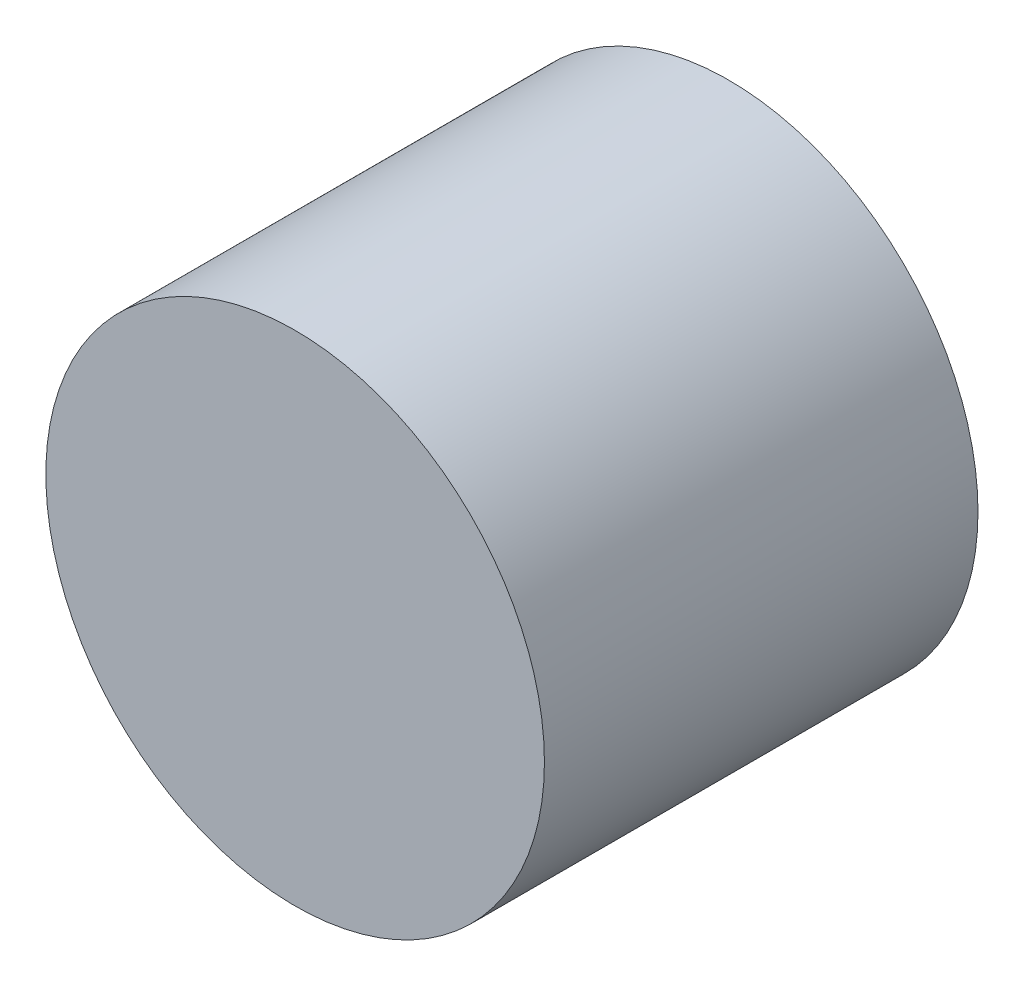
ISO-10303-21;
HEADER;
FILE_DESCRIPTION(('STEP AP214'),'2;1');
FILE_NAME('part.step','',(''),(''),'','','');
FILE_SCHEMA(('AUTOMOTIVE_DESIGN { 1 0 10303 214 1 1 1 1 }'));
ENDSEC;
DATA;
#1=APPLICATION_CONTEXT('core data for automotive mechanical design processes');
#2=APPLICATION_PROTOCOL_DEFINITION('international standard','automotive_design',2000,#1);
#3=PRODUCT_CONTEXT('',#1,'mechanical');
#4=PRODUCT('Part','Part','',(#3));
#5=PRODUCT_RELATED_PRODUCT_CATEGORY('part','',(#4));
#6=PRODUCT_DEFINITION_FORMATION('','',#4);
#7=PRODUCT_DEFINITION_CONTEXT('part definition',#1,'design');
#8=PRODUCT_DEFINITION('design','',#6,#7);
#9=PRODUCT_DEFINITION_SHAPE('','',#8);
#10=(LENGTH_UNIT() NAMED_UNIT(*) SI_UNIT(.MILLI.,.METRE.));
#11=(NAMED_UNIT(*) PLANE_ANGLE_UNIT() SI_UNIT($,.RADIAN.));
#12=(NAMED_UNIT(*) SI_UNIT($,.STERADIAN.) SOLID_ANGLE_UNIT());
#13=UNCERTAINTY_MEASURE_WITH_UNIT(LENGTH_MEASURE(1.E-05),#10,'distance_accuracy_value','');
#14=(GEOMETRIC_REPRESENTATION_CONTEXT(3) GLOBAL_UNCERTAINTY_ASSIGNED_CONTEXT((#13)) GLOBAL_UNIT_ASSIGNED_CONTEXT((#10,
#11,#12)) REPRESENTATION_CONTEXT('',''));
#15=CARTESIAN_POINT('',(0.,0.,0.));
#16=DIRECTION('',(0.,0.,1.));
#17=DIRECTION('',(1.,0.,0.));
#18=AXIS2_PLACEMENT_3D('',#15,#16,#17);
#19=CARTESIAN_POINT('',(0.,0.,10.));
#20=DIRECTION('',(0.,0.,-1.));
#21=DIRECTION('',(-1.,0.,0.));
#22=AXIS2_PLACEMENT_3D('',#19,#20,#21);
#23=CYLINDRICAL_SURFACE('',#22,5.75);
#24=CARTESIAN_POINT('',(0.,0.,10.));
#25=DIRECTION('',(0.,0.,1.));
#26=DIRECTION('',(1.,0.,0.));
#27=AXIS2_PLACEMENT_3D('',#24,#25,#26);
#28=CIRCLE('',#27,5.75);
#29=CARTESIAN_POINT('',(5.75,0.,10.));
#30=VERTEX_POINT('',#29);
#31=EDGE_CURVE('E10',#30,#30,#28,.T.);
#32=ORIENTED_EDGE('',*,*,#31,.F.);
#33=EDGE_LOOP('',(#32));
#34=FACE_BOUND('',#33,.T.);
#35=CARTESIAN_POINT('',(0.,0.,0.));
#36=DIRECTION('',(0.,0.,1.));
#37=DIRECTION('',(1.,0.,0.));
#38=AXIS2_PLACEMENT_3D('',#35,#36,#37);
#39=CIRCLE('',#38,5.75);
#40=CARTESIAN_POINT('',(5.75,0.,0.));
#41=VERTEX_POINT('',#40);
#42=EDGE_CURVE('E46',#41,#41,#39,.T.);
#43=ORIENTED_EDGE('',*,*,#42,.T.);
#44=EDGE_LOOP('',(#43));
#45=FACE_BOUND('',#44,.T.);
#46=ADVANCED_FACE('F43',(#34,#45),#23,.T.);
#47=CARTESIAN_POINT('',(0.,0.,10.));
#48=DIRECTION('',(0.,0.,1.));
#49=DIRECTION('',(1.,0.,0.));
#50=AXIS2_PLACEMENT_3D('',#47,#48,#49);
#51=PLANE('',#50);
#52=ORIENTED_EDGE('',*,*,#31,.T.);
#53=EDGE_LOOP('',(#52));
#54=FACE_BOUND('',#53,.T.);
#55=ADVANCED_FACE('F60',(#54),#51,.T.);
#56=CARTESIAN_POINT('',(0.,0.,0.));
#57=DIRECTION('',(0.,0.,1.));
#58=DIRECTION('',(1.,0.,0.));
#59=AXIS2_PLACEMENT_3D('',#56,#57,#58);
#60=PLANE('',#59);
#61=ORIENTED_EDGE('',*,*,#42,.F.);
#62=EDGE_LOOP('',(#61));
#63=FACE_BOUND('',#62,.T.);
#64=ADVANCED_FACE('F58',(#63),#60,.F.);
#65=CLOSED_SHELL('',(#46,#55,#64));
#66=MANIFOLD_SOLID_BREP('B2',#65);
#67=ADVANCED_BREP_SHAPE_REPRESENTATION('',(#18,#66),#14);
#68=SHAPE_DEFINITION_REPRESENTATION(#9,#67);
ENDSEC;
END-ISO-10303-21;
